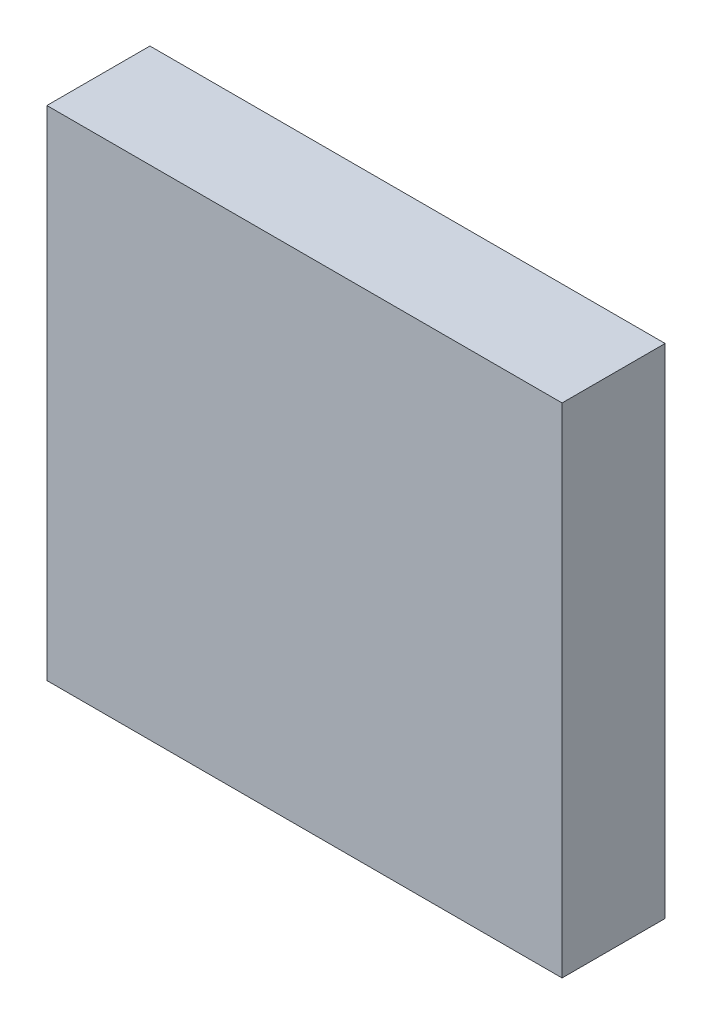
ISO-10303-21;
HEADER;
FILE_DESCRIPTION(('STEP AP214'),'2;1');
FILE_NAME('part.step','',(''),(''),'','','');
FILE_SCHEMA(('AUTOMOTIVE_DESIGN { 1 0 10303 214 1 1 1 1 }'));
ENDSEC;
DATA;
#1=APPLICATION_CONTEXT('core data for automotive mechanical design processes');
#2=APPLICATION_PROTOCOL_DEFINITION('international standard','automotive_design',2000,#1);
#3=PRODUCT_CONTEXT('',#1,'mechanical');
#4=PRODUCT('Part','Part','',(#3));
#5=PRODUCT_RELATED_PRODUCT_CATEGORY('part','',(#4));
#6=PRODUCT_DEFINITION_FORMATION('','',#4);
#7=PRODUCT_DEFINITION_CONTEXT('part definition',#1,'design');
#8=PRODUCT_DEFINITION('design','',#6,#7);
#9=PRODUCT_DEFINITION_SHAPE('','',#8);
#10=(LENGTH_UNIT() NAMED_UNIT(*) SI_UNIT(.MILLI.,.METRE.));
#11=(NAMED_UNIT(*) PLANE_ANGLE_UNIT() SI_UNIT($,.RADIAN.));
#12=(NAMED_UNIT(*) SI_UNIT($,.STERADIAN.) SOLID_ANGLE_UNIT());
#13=UNCERTAINTY_MEASURE_WITH_UNIT(LENGTH_MEASURE(1.E-05),#10,'distance_accuracy_value','');
#14=(GEOMETRIC_REPRESENTATION_CONTEXT(3) GLOBAL_UNCERTAINTY_ASSIGNED_CONTEXT((#13)) GLOBAL_UNIT_ASSIGNED_CONTEXT((#10,
#11,#12)) REPRESENTATION_CONTEXT('',''));
#15=CARTESIAN_POINT('',(0.,0.,0.));
#16=DIRECTION('',(0.,0.,1.));
#17=DIRECTION('',(1.,0.,0.));
#18=AXIS2_PLACEMENT_3D('',#15,#16,#17);
#19=CARTESIAN_POINT('',(-30.,42.,18.));
#20=DIRECTION('',(1.,0.,0.));
#21=DIRECTION('',(0.,0.,-1.));
#22=AXIS2_PLACEMENT_3D('',#19,#20,#21);
#23=PLANE('',#22);
#24=DIRECTION('',(0.,-1.,0.));
#25=VECTOR('',#24,1.);
#26=CARTESIAN_POINT('',(-30.,42.,6.));
#27=LINE('',#26,#25);
#28=CARTESIAN_POINT('',(-30.,100.,6.));
#29=VERTEX_POINT('',#28);
#30=CARTESIAN_POINT('',(-30.,42.,6.));
#31=VERTEX_POINT('',#30);
#32=EDGE_CURVE('E104',#29,#31,#27,.T.);
#33=ORIENTED_EDGE('',*,*,#32,.T.);
#34=DIRECTION('',(0.,0.,-1.));
#35=VECTOR('',#34,1.);
#36=CARTESIAN_POINT('',(-30.,42.,18.));
#37=LINE('',#36,#35);
#38=CARTESIAN_POINT('',(-30.,42.,18.));
#39=VERTEX_POINT('',#38);
#40=EDGE_CURVE('E11',#39,#31,#37,.T.);
#41=ORIENTED_EDGE('',*,*,#40,.F.);
#42=DIRECTION('',(0.,-1.,0.));
#43=VECTOR('',#42,1.);
#44=CARTESIAN_POINT('',(-30.,42.,18.));
#45=LINE('',#44,#43);
#46=CARTESIAN_POINT('',(-30.,100.,18.));
#47=VERTEX_POINT('',#46);
#48=EDGE_CURVE('E92',#47,#39,#45,.T.);
#49=ORIENTED_EDGE('',*,*,#48,.F.);
#50=DIRECTION('',(0.,0.,-1.));
#51=VECTOR('',#50,1.);
#52=CARTESIAN_POINT('',(-30.,100.,18.));
#53=LINE('',#52,#51);
#54=EDGE_CURVE('E100',#47,#29,#53,.T.);
#55=ORIENTED_EDGE('',*,*,#54,.T.);
#56=EDGE_LOOP('',(#33,#41,#49,#55));
#57=FACE_BOUND('',#56,.T.);
#58=ADVANCED_FACE('F41',(#57),#23,.F.);
#59=CARTESIAN_POINT('',(-30.,42.,18.));
#60=DIRECTION('',(0.,1.,0.));
#61=DIRECTION('',(0.,0.,1.));
#62=AXIS2_PLACEMENT_3D('',#59,#60,#61);
#63=PLANE('',#62);
#64=DIRECTION('',(1.,0.,0.));
#65=VECTOR('',#64,1.);
#66=CARTESIAN_POINT('',(-30.,42.,6.));
#67=LINE('',#66,#65);
#68=CARTESIAN_POINT('',(30.,42.,6.));
#69=VERTEX_POINT('',#68);
#70=EDGE_CURVE('E96',#31,#69,#67,.T.);
#71=ORIENTED_EDGE('',*,*,#70,.T.);
#72=DIRECTION('',(0.,0.,-1.));
#73=VECTOR('',#72,1.);
#74=CARTESIAN_POINT('',(30.,42.,18.));
#75=LINE('',#74,#73);
#76=CARTESIAN_POINT('',(30.,42.,18.));
#77=VERTEX_POINT('',#76);
#78=EDGE_CURVE('E49',#77,#69,#75,.T.);
#79=ORIENTED_EDGE('',*,*,#78,.F.);
#80=DIRECTION('',(1.,0.,0.));
#81=VECTOR('',#80,1.);
#82=CARTESIAN_POINT('',(-30.,42.,18.));
#83=LINE('',#82,#81);
#84=EDGE_CURVE('E87',#39,#77,#83,.T.);
#85=ORIENTED_EDGE('',*,*,#84,.F.);
#86=ORIENTED_EDGE('',*,*,#40,.T.);
#87=EDGE_LOOP('',(#71,#79,#85,#86));
#88=FACE_BOUND('',#87,.T.);
#89=ADVANCED_FACE('F95',(#88),#63,.F.);
#90=CARTESIAN_POINT('',(30.,42.,18.));
#91=DIRECTION('',(-1.,0.,0.));
#92=DIRECTION('',(0.,0.,1.));
#93=AXIS2_PLACEMENT_3D('',#90,#91,#92);
#94=PLANE('',#93);
#95=DIRECTION('',(0.,1.,0.));
#96=VECTOR('',#95,1.);
#97=CARTESIAN_POINT('',(30.,42.,6.));
#98=LINE('',#97,#96);
#99=CARTESIAN_POINT('',(30.,100.,6.));
#100=VERTEX_POINT('',#99);
#101=EDGE_CURVE('E74',#69,#100,#98,.T.);
#102=ORIENTED_EDGE('',*,*,#101,.T.);
#103=DIRECTION('',(0.,0.,-1.));
#104=VECTOR('',#103,1.);
#105=CARTESIAN_POINT('',(30.,100.,18.));
#106=LINE('',#105,#104);
#107=CARTESIAN_POINT('',(30.,100.,18.));
#108=VERTEX_POINT('',#107);
#109=EDGE_CURVE('E97',#108,#100,#106,.T.);
#110=ORIENTED_EDGE('',*,*,#109,.F.);
#111=DIRECTION('',(0.,1.,0.));
#112=VECTOR('',#111,1.);
#113=CARTESIAN_POINT('',(30.,42.,18.));
#114=LINE('',#113,#112);
#115=EDGE_CURVE('E90',#77,#108,#114,.T.);
#116=ORIENTED_EDGE('',*,*,#115,.F.);
#117=ORIENTED_EDGE('',*,*,#78,.T.);
#118=EDGE_LOOP('',(#102,#110,#116,#117));
#119=FACE_BOUND('',#118,.T.);
#120=ADVANCED_FACE('F98',(#119),#94,.F.);
#121=CARTESIAN_POINT('',(-30.,100.,18.));
#122=DIRECTION('',(0.,-1.,0.));
#123=DIRECTION('',(0.,0.,-1.));
#124=AXIS2_PLACEMENT_3D('',#121,#122,#123);
#125=PLANE('',#124);
#126=DIRECTION('',(-1.,0.,0.));
#127=VECTOR('',#126,1.);
#128=CARTESIAN_POINT('',(-30.,100.,6.));
#129=LINE('',#128,#127);
#130=EDGE_CURVE('E80',#100,#29,#129,.T.);
#131=ORIENTED_EDGE('',*,*,#130,.T.);
#132=ORIENTED_EDGE('',*,*,#54,.F.);
#133=DIRECTION('',(-1.,0.,0.));
#134=VECTOR('',#133,1.);
#135=CARTESIAN_POINT('',(-30.,100.,18.));
#136=LINE('',#135,#134);
#137=EDGE_CURVE('E57',#108,#47,#136,.T.);
#138=ORIENTED_EDGE('',*,*,#137,.F.);
#139=ORIENTED_EDGE('',*,*,#109,.T.);
#140=EDGE_LOOP('',(#131,#132,#138,#139));
#141=FACE_BOUND('',#140,.T.);
#142=ADVANCED_FACE('F111',(#141),#125,.F.);
#143=CARTESIAN_POINT('',(0.,0.,18.));
#144=DIRECTION('',(0.,0.,-1.));
#145=DIRECTION('',(-1.,0.,0.));
#146=AXIS2_PLACEMENT_3D('',#143,#144,#145);
#147=PLANE('',#146);
#148=ORIENTED_EDGE('',*,*,#48,.T.);
#149=ORIENTED_EDGE('',*,*,#84,.T.);
#150=ORIENTED_EDGE('',*,*,#115,.T.);
#151=ORIENTED_EDGE('',*,*,#137,.T.);
#152=EDGE_LOOP('',(#148,#149,#150,#151));
#153=FACE_BOUND('',#152,.T.);
#154=ADVANCED_FACE('F88',(#153),#147,.F.);
#155=CARTESIAN_POINT('',(0.,0.,6.));
#156=DIRECTION('',(0.,0.,-1.));
#157=DIRECTION('',(-1.,0.,0.));
#158=AXIS2_PLACEMENT_3D('',#155,#156,#157);
#159=PLANE('',#158);
#160=ORIENTED_EDGE('',*,*,#32,.F.);
#161=ORIENTED_EDGE('',*,*,#130,.F.);
#162=ORIENTED_EDGE('',*,*,#101,.F.);
#163=ORIENTED_EDGE('',*,*,#70,.F.);
#164=EDGE_LOOP('',(#160,#161,#162,#163));
#165=FACE_BOUND('',#164,.T.);
#166=ADVANCED_FACE('F114',(#165),#159,.T.);
#167=CLOSED_SHELL('',(#58,#89,#120,#142,#154,#166));
#168=MANIFOLD_SOLID_BREP('B2',#167);
#169=ADVANCED_BREP_SHAPE_REPRESENTATION('',(#18,#168),#14);
#170=SHAPE_DEFINITION_REPRESENTATION(#9,#169);
ENDSEC;
END-ISO-10303-21;
